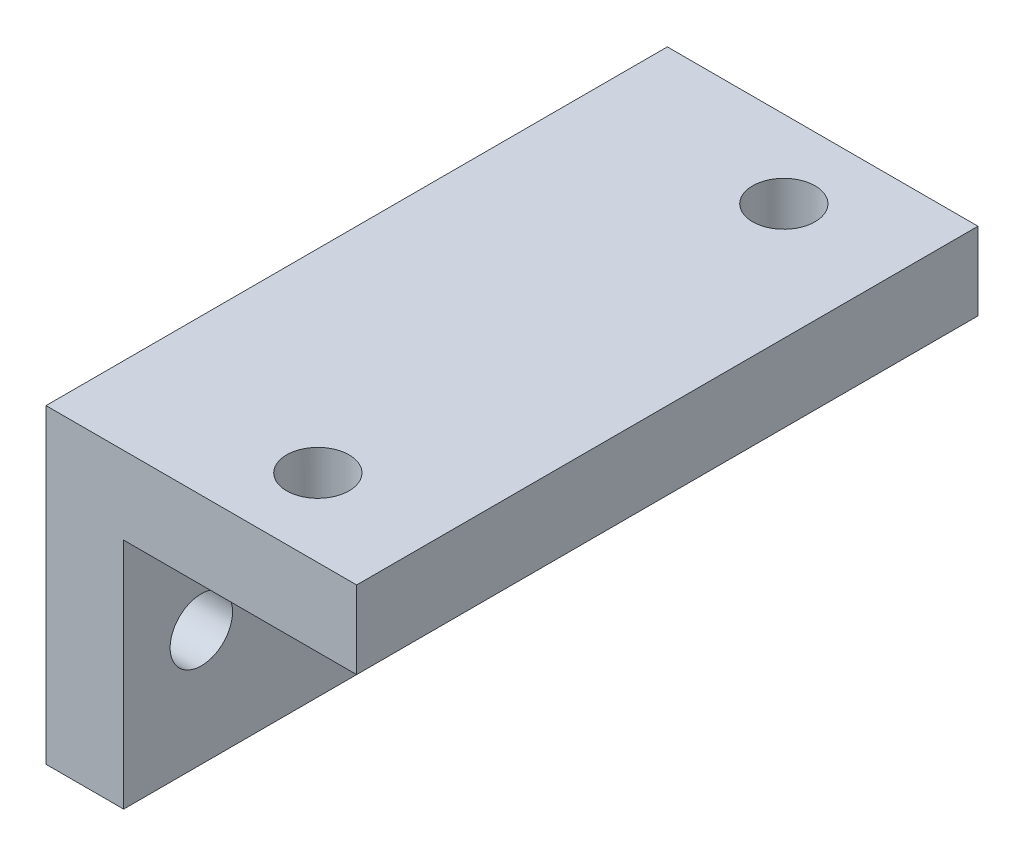
ISO-10303-21;
HEADER;
FILE_DESCRIPTION(('STEP AP214'),'2;1');
FILE_NAME('part.step','',(''),(''),'','','');
FILE_SCHEMA(('AUTOMOTIVE_DESIGN { 1 0 10303 214 1 1 1 1 }'));
ENDSEC;
DATA;
#1=APPLICATION_CONTEXT('core data for automotive mechanical design processes');
#2=APPLICATION_PROTOCOL_DEFINITION('international standard','automotive_design',2000,#1);
#3=PRODUCT_CONTEXT('',#1,'mechanical');
#4=PRODUCT('Part','Part','',(#3));
#5=PRODUCT_RELATED_PRODUCT_CATEGORY('part','',(#4));
#6=PRODUCT_DEFINITION_FORMATION('','',#4);
#7=PRODUCT_DEFINITION_CONTEXT('part definition',#1,'design');
#8=PRODUCT_DEFINITION('design','',#6,#7);
#9=PRODUCT_DEFINITION_SHAPE('','',#8);
#10=(LENGTH_UNIT() NAMED_UNIT(*) SI_UNIT(.MILLI.,.METRE.));
#11=(NAMED_UNIT(*) PLANE_ANGLE_UNIT() SI_UNIT($,.RADIAN.));
#12=(NAMED_UNIT(*) SI_UNIT($,.STERADIAN.) SOLID_ANGLE_UNIT());
#13=UNCERTAINTY_MEASURE_WITH_UNIT(LENGTH_MEASURE(1.E-05),#10,'distance_accuracy_value','');
#14=(GEOMETRIC_REPRESENTATION_CONTEXT(3) GLOBAL_UNCERTAINTY_ASSIGNED_CONTEXT((#13)) GLOBAL_UNIT_ASSIGNED_CONTEXT((#10,
#11,#12)) REPRESENTATION_CONTEXT('',''));
#15=CARTESIAN_POINT('',(0.,0.,0.));
#16=DIRECTION('',(0.,0.,1.));
#17=DIRECTION('',(1.,0.,0.));
#18=AXIS2_PLACEMENT_3D('',#15,#16,#17);
#19=CARTESIAN_POINT('',(0.,-19.05,25.4));
#20=DIRECTION('',(-1.,0.,0.));
#21=DIRECTION('',(0.,-1.,0.));
#22=AXIS2_PLACEMENT_3D('',#19,#20,#21);
#23=PLANE('',#22);
#24=CARTESIAN_POINT('',(0.,-9.525,-19.05));
#25=DIRECTION('',(1.,0.,0.));
#26=DIRECTION('',(0.,0.,-1.));
#27=AXIS2_PLACEMENT_3D('',#24,#25,#26);
#28=CIRCLE('',#27,2.55269999999999);
#29=CARTESIAN_POINT('',(0.,-9.525,-21.6027));
#30=VERTEX_POINT('',#29);
#31=EDGE_CURVE('E162',#30,#30,#28,.T.);
#32=ORIENTED_EDGE('',*,*,#31,.F.);
#33=EDGE_LOOP('',(#32));
#34=FACE_BOUND('',#33,.T.);
#35=CARTESIAN_POINT('',(0.,-9.525,19.05));
#36=DIRECTION('',(1.,0.,0.));
#37=DIRECTION('',(0.,0.,-1.));
#38=AXIS2_PLACEMENT_3D('',#35,#36,#37);
#39=CIRCLE('',#38,2.55269999999999);
#40=CARTESIAN_POINT('',(0.,-9.525,16.4973));
#41=VERTEX_POINT('',#40);
#42=EDGE_CURVE('E165',#41,#41,#39,.T.);
#43=ORIENTED_EDGE('',*,*,#42,.F.);
#44=EDGE_LOOP('',(#43));
#45=FACE_BOUND('',#44,.T.);
#46=DIRECTION('',(0.,1.,0.));
#47=VECTOR('',#46,1.);
#48=CARTESIAN_POINT('',(0.,-19.05,-25.4));
#49=LINE('',#48,#47);
#50=CARTESIAN_POINT('',(0.,-19.05,-25.4));
#51=VERTEX_POINT('',#50);
#52=CARTESIAN_POINT('',(0.,0.,-25.4));
#53=VERTEX_POINT('',#52);
#54=EDGE_CURVE('E117',#51,#53,#49,.T.);
#55=ORIENTED_EDGE('',*,*,#54,.T.);
#56=DIRECTION('',(0.,0.,-1.));
#57=VECTOR('',#56,1.);
#58=CARTESIAN_POINT('',(0.,0.,25.4));
#59=LINE('',#58,#57);
#60=CARTESIAN_POINT('',(0.,0.,25.4));
#61=VERTEX_POINT('',#60);
#62=EDGE_CURVE('E11',#61,#53,#59,.T.);
#63=ORIENTED_EDGE('',*,*,#62,.F.);
#64=DIRECTION('',(0.,1.,0.));
#65=VECTOR('',#64,1.);
#66=CARTESIAN_POINT('',(0.,-19.05,25.4));
#67=LINE('',#66,#65);
#68=CARTESIAN_POINT('',(0.,-19.05,25.4));
#69=VERTEX_POINT('',#68);
#70=EDGE_CURVE('E128',#69,#61,#67,.T.);
#71=ORIENTED_EDGE('',*,*,#70,.F.);
#72=DIRECTION('',(0.,0.,-1.));
#73=VECTOR('',#72,1.);
#74=CARTESIAN_POINT('',(0.,-19.05,25.4));
#75=LINE('',#74,#73);
#76=EDGE_CURVE('E113',#69,#51,#75,.T.);
#77=ORIENTED_EDGE('',*,*,#76,.T.);
#78=EDGE_LOOP('',(#55,#63,#71,#77));
#79=FACE_BOUND('',#78,.T.);
#80=ADVANCED_FACE('F33',(#34,#45,#79),#23,.F.);
#81=CARTESIAN_POINT('',(0.,0.,25.4));
#82=DIRECTION('',(0.,1.,0.));
#83=DIRECTION('',(0.,0.,1.));
#84=AXIS2_PLACEMENT_3D('',#81,#82,#83);
#85=PLANE('',#84);
#86=CARTESIAN_POINT('',(9.525,0.,19.05));
#87=DIRECTION('',(0.,-1.,0.));
#88=DIRECTION('',(0.,0.,-1.));
#89=AXIS2_PLACEMENT_3D('',#86,#87,#88);
#90=CIRCLE('',#89,2.55269999999999);
#91=CARTESIAN_POINT('',(9.525,0.,16.4973));
#92=VERTEX_POINT('',#91);
#93=EDGE_CURVE('E171',#92,#92,#90,.T.);
#94=ORIENTED_EDGE('',*,*,#93,.F.);
#95=EDGE_LOOP('',(#94));
#96=FACE_BOUND('',#95,.T.);
#97=CARTESIAN_POINT('',(9.52500000000001,0.,-19.05));
#98=DIRECTION('',(0.,-1.,0.));
#99=DIRECTION('',(0.,0.,-1.));
#100=AXIS2_PLACEMENT_3D('',#97,#98,#99);
#101=CIRCLE('',#100,2.55269999999999);
#102=CARTESIAN_POINT('',(9.52500000000001,0.,-21.6027));
#103=VERTEX_POINT('',#102);
#104=EDGE_CURVE('E182',#103,#103,#101,.T.);
#105=ORIENTED_EDGE('',*,*,#104,.F.);
#106=EDGE_LOOP('',(#105));
#107=FACE_BOUND('',#106,.T.);
#108=DIRECTION('',(1.,0.,0.));
#109=VECTOR('',#108,1.);
#110=CARTESIAN_POINT('',(0.,0.,-25.4));
#111=LINE('',#110,#109);
#112=CARTESIAN_POINT('',(19.05,0.,-25.4));
#113=VERTEX_POINT('',#112);
#114=EDGE_CURVE('E120',#53,#113,#111,.T.);
#115=ORIENTED_EDGE('',*,*,#114,.T.);
#116=DIRECTION('',(0.,0.,-1.));
#117=VECTOR('',#116,1.);
#118=CARTESIAN_POINT('',(19.05,0.,25.4));
#119=LINE('',#118,#117);
#120=CARTESIAN_POINT('',(19.05,0.,25.4));
#121=VERTEX_POINT('',#120);
#122=EDGE_CURVE('E41',#121,#113,#119,.T.);
#123=ORIENTED_EDGE('',*,*,#122,.F.);
#124=DIRECTION('',(1.,0.,0.));
#125=VECTOR('',#124,1.);
#126=CARTESIAN_POINT('',(0.,0.,25.4));
#127=LINE('',#126,#125);
#128=EDGE_CURVE('E86',#61,#121,#127,.T.);
#129=ORIENTED_EDGE('',*,*,#128,.F.);
#130=ORIENTED_EDGE('',*,*,#62,.T.);
#131=EDGE_LOOP('',(#115,#123,#129,#130));
#132=FACE_BOUND('',#131,.T.);
#133=ADVANCED_FACE('F153',(#96,#107,#132),#85,.F.);
#134=CARTESIAN_POINT('',(19.05,0.,25.4));
#135=DIRECTION('',(-1.,0.,0.));
#136=DIRECTION('',(0.,0.,1.));
#137=AXIS2_PLACEMENT_3D('',#134,#135,#136);
#138=PLANE('',#137);
#139=DIRECTION('',(0.,1.,0.));
#140=VECTOR('',#139,1.);
#141=CARTESIAN_POINT('',(19.05,0.,-25.4));
#142=LINE('',#141,#140);
#143=CARTESIAN_POINT('',(19.05,6.34999999999999,-25.4));
#144=VERTEX_POINT('',#143);
#145=EDGE_CURVE('E123',#113,#144,#142,.T.);
#146=ORIENTED_EDGE('',*,*,#145,.T.);
#147=DIRECTION('',(0.,0.,-1.));
#148=VECTOR('',#147,1.);
#149=CARTESIAN_POINT('',(19.05,6.34999999999999,25.4));
#150=LINE('',#149,#148);
#151=CARTESIAN_POINT('',(19.05,6.34999999999999,25.4));
#152=VERTEX_POINT('',#151);
#153=EDGE_CURVE('E108',#152,#144,#150,.T.);
#154=ORIENTED_EDGE('',*,*,#153,.F.);
#155=DIRECTION('',(0.,1.,0.));
#156=VECTOR('',#155,1.);
#157=CARTESIAN_POINT('',(19.05,0.,25.4));
#158=LINE('',#157,#156);
#159=EDGE_CURVE('E99',#121,#152,#158,.T.);
#160=ORIENTED_EDGE('',*,*,#159,.F.);
#161=ORIENTED_EDGE('',*,*,#122,.T.);
#162=EDGE_LOOP('',(#146,#154,#160,#161));
#163=FACE_BOUND('',#162,.T.);
#164=ADVANCED_FACE('F134',(#163),#138,.F.);
#165=CARTESIAN_POINT('',(19.05,6.34999999999999,25.4));
#166=DIRECTION('',(0.,-1.,0.));
#167=DIRECTION('',(1.,0.,0.));
#168=AXIS2_PLACEMENT_3D('',#165,#166,#167);
#169=PLANE('',#168);
#170=CARTESIAN_POINT('',(9.525,6.35,19.05));
#171=DIRECTION('',(0.,-1.,0.));
#172=DIRECTION('',(1.,0.,0.));
#173=AXIS2_PLACEMENT_3D('',#170,#171,#172);
#174=CIRCLE('',#173,2.55269999999999);
#175=CARTESIAN_POINT('',(12.0777,6.35,19.05));
#176=VERTEX_POINT('',#175);
#177=EDGE_CURVE('E179',#176,#176,#174,.T.);
#178=ORIENTED_EDGE('',*,*,#177,.T.);
#179=EDGE_LOOP('',(#178));
#180=FACE_BOUND('',#179,.T.);
#181=CARTESIAN_POINT('',(9.52500000000001,6.35,-19.05));
#182=DIRECTION('',(0.,-1.,0.));
#183=DIRECTION('',(1.,0.,0.));
#184=AXIS2_PLACEMENT_3D('',#181,#182,#183);
#185=CIRCLE('',#184,2.55269999999999);
#186=CARTESIAN_POINT('',(12.0777,6.35,-19.05));
#187=VERTEX_POINT('',#186);
#188=EDGE_CURVE('E121',#187,#187,#185,.T.);
#189=ORIENTED_EDGE('',*,*,#188,.T.);
#190=EDGE_LOOP('',(#189));
#191=FACE_BOUND('',#190,.T.);
#192=DIRECTION('',(-1.,0.,0.));
#193=VECTOR('',#192,1.);
#194=CARTESIAN_POINT('',(19.05,6.34999999999999,-25.4));
#195=LINE('',#194,#193);
#196=CARTESIAN_POINT('',(-6.35000000000001,6.35,-25.4));
#197=VERTEX_POINT('',#196);
#198=EDGE_CURVE('E107',#144,#197,#195,.T.);
#199=ORIENTED_EDGE('',*,*,#198,.T.);
#200=DIRECTION('',(0.,0.,-1.));
#201=VECTOR('',#200,1.);
#202=CARTESIAN_POINT('',(-6.35000000000001,6.35,25.4));
#203=LINE('',#202,#201);
#204=CARTESIAN_POINT('',(-6.35000000000001,6.35,25.4));
#205=VERTEX_POINT('',#204);
#206=EDGE_CURVE('E104',#205,#197,#203,.T.);
#207=ORIENTED_EDGE('',*,*,#206,.F.);
#208=DIRECTION('',(-1.,0.,0.));
#209=VECTOR('',#208,1.);
#210=CARTESIAN_POINT('',(19.05,6.34999999999999,25.4));
#211=LINE('',#210,#209);
#212=EDGE_CURVE('E93',#152,#205,#211,.T.);
#213=ORIENTED_EDGE('',*,*,#212,.F.);
#214=ORIENTED_EDGE('',*,*,#153,.T.);
#215=EDGE_LOOP('',(#199,#207,#213,#214));
#216=FACE_BOUND('',#215,.T.);
#217=ADVANCED_FACE('F105',(#180,#191,#216),#169,.F.);
#218=CARTESIAN_POINT('',(-6.35000000000001,6.35,25.4));
#219=DIRECTION('',(1.,0.,0.));
#220=DIRECTION('',(0.,1.,0.));
#221=AXIS2_PLACEMENT_3D('',#218,#219,#220);
#222=PLANE('',#221);
#223=CARTESIAN_POINT('',(-6.35,-9.525,-19.05));
#224=DIRECTION('',(1.,0.,0.));
#225=DIRECTION('',(0.,0.,-1.));
#226=AXIS2_PLACEMENT_3D('',#223,#224,#225);
#227=CIRCLE('',#226,2.55269999999999);
#228=CARTESIAN_POINT('',(-6.35,-9.525,-21.6027));
#229=VERTEX_POINT('',#228);
#230=EDGE_CURVE('E168',#229,#229,#227,.T.);
#231=ORIENTED_EDGE('',*,*,#230,.T.);
#232=EDGE_LOOP('',(#231));
#233=FACE_BOUND('',#232,.T.);
#234=CARTESIAN_POINT('',(-6.35,-9.525,19.05));
#235=DIRECTION('',(1.,0.,0.));
#236=DIRECTION('',(0.,0.,-1.));
#237=AXIS2_PLACEMENT_3D('',#234,#235,#236);
#238=CIRCLE('',#237,2.55269999999999);
#239=CARTESIAN_POINT('',(-6.35,-9.525,16.4973));
#240=VERTEX_POINT('',#239);
#241=EDGE_CURVE('E167',#240,#240,#238,.T.);
#242=ORIENTED_EDGE('',*,*,#241,.T.);
#243=EDGE_LOOP('',(#242));
#244=FACE_BOUND('',#243,.T.);
#245=DIRECTION('',(0.,-1.,0.));
#246=VECTOR('',#245,1.);
#247=CARTESIAN_POINT('',(-6.35000000000001,6.35,-25.4));
#248=LINE('',#247,#246);
#249=CARTESIAN_POINT('',(-6.35,-19.05,-25.4));
#250=VERTEX_POINT('',#249);
#251=EDGE_CURVE('E72',#197,#250,#248,.T.);
#252=ORIENTED_EDGE('',*,*,#251,.T.);
#253=DIRECTION('',(0.,0.,-1.));
#254=VECTOR('',#253,1.);
#255=CARTESIAN_POINT('',(-6.35,-19.05,25.4));
#256=LINE('',#255,#254);
#257=CARTESIAN_POINT('',(-6.35,-19.05,25.4));
#258=VERTEX_POINT('',#257);
#259=EDGE_CURVE('E109',#258,#250,#256,.T.);
#260=ORIENTED_EDGE('',*,*,#259,.F.);
#261=DIRECTION('',(0.,-1.,0.));
#262=VECTOR('',#261,1.);
#263=CARTESIAN_POINT('',(-6.35000000000001,6.35,25.4));
#264=LINE('',#263,#262);
#265=EDGE_CURVE('E97',#205,#258,#264,.T.);
#266=ORIENTED_EDGE('',*,*,#265,.F.);
#267=ORIENTED_EDGE('',*,*,#206,.T.);
#268=EDGE_LOOP('',(#252,#260,#266,#267));
#269=FACE_BOUND('',#268,.T.);
#270=ADVANCED_FACE('F111',(#233,#244,#269),#222,.F.);
#271=CARTESIAN_POINT('',(-6.35,-19.05,25.4));
#272=DIRECTION('',(0.,1.,0.));
#273=DIRECTION('',(0.,0.,1.));
#274=AXIS2_PLACEMENT_3D('',#271,#272,#273);
#275=PLANE('',#274);
#276=DIRECTION('',(1.,0.,0.));
#277=VECTOR('',#276,1.);
#278=CARTESIAN_POINT('',(-6.35,-19.05,-25.4));
#279=LINE('',#278,#277);
#280=EDGE_CURVE('E78',#250,#51,#279,.T.);
#281=ORIENTED_EDGE('',*,*,#280,.T.);
#282=ORIENTED_EDGE('',*,*,#76,.F.);
#283=DIRECTION('',(1.,0.,0.));
#284=VECTOR('',#283,1.);
#285=CARTESIAN_POINT('',(-6.35,-19.05,25.4));
#286=LINE('',#285,#284);
#287=EDGE_CURVE('E49',#258,#69,#286,.T.);
#288=ORIENTED_EDGE('',*,*,#287,.F.);
#289=ORIENTED_EDGE('',*,*,#259,.T.);
#290=EDGE_LOOP('',(#281,#282,#288,#289));
#291=FACE_BOUND('',#290,.T.);
#292=ADVANCED_FACE('F141',(#291),#275,.F.);
#293=CARTESIAN_POINT('',(0.,0.,25.4));
#294=DIRECTION('',(0.,0.,-1.));
#295=DIRECTION('',(-1.,0.,0.));
#296=AXIS2_PLACEMENT_3D('',#293,#294,#295);
#297=PLANE('',#296);
#298=ORIENTED_EDGE('',*,*,#70,.T.);
#299=ORIENTED_EDGE('',*,*,#128,.T.);
#300=ORIENTED_EDGE('',*,*,#159,.T.);
#301=ORIENTED_EDGE('',*,*,#212,.T.);
#302=ORIENTED_EDGE('',*,*,#265,.T.);
#303=ORIENTED_EDGE('',*,*,#287,.T.);
#304=EDGE_LOOP('',(#298,#299,#300,#301,#302,#303));
#305=FACE_BOUND('',#304,.T.);
#306=ADVANCED_FACE('F95',(#305),#297,.F.);
#307=CARTESIAN_POINT('',(0.,0.,-25.4));
#308=DIRECTION('',(0.,0.,-1.));
#309=DIRECTION('',(-1.,0.,0.));
#310=AXIS2_PLACEMENT_3D('',#307,#308,#309);
#311=PLANE('',#310);
#312=ORIENTED_EDGE('',*,*,#54,.F.);
#313=ORIENTED_EDGE('',*,*,#280,.F.);
#314=ORIENTED_EDGE('',*,*,#251,.F.);
#315=ORIENTED_EDGE('',*,*,#198,.F.);
#316=ORIENTED_EDGE('',*,*,#145,.F.);
#317=ORIENTED_EDGE('',*,*,#114,.F.);
#318=EDGE_LOOP('',(#312,#313,#314,#315,#316,#317));
#319=FACE_BOUND('',#318,.T.);
#320=ADVANCED_FACE('F137',(#319),#311,.T.);
#321=CARTESIAN_POINT('',(9.52500000000001,0.,-19.05));
#322=DIRECTION('',(0.,-1.,0.));
#323=DIRECTION('',(0.,0.,-1.));
#324=AXIS2_PLACEMENT_3D('',#321,#322,#323);
#325=CYLINDRICAL_SURFACE('',#324,2.55269999999999);
#326=ORIENTED_EDGE('',*,*,#188,.F.);
#327=EDGE_LOOP('',(#326));
#328=FACE_BOUND('',#327,.T.);
#329=ORIENTED_EDGE('',*,*,#104,.T.);
#330=EDGE_LOOP('',(#329));
#331=FACE_BOUND('',#330,.T.);
#332=ADVANCED_FACE('F191',(#328,#331),#325,.F.);
#333=CARTESIAN_POINT('',(9.525,0.,19.05));
#334=DIRECTION('',(0.,-1.,0.));
#335=DIRECTION('',(0.,0.,-1.));
#336=AXIS2_PLACEMENT_3D('',#333,#334,#335);
#337=CYLINDRICAL_SURFACE('',#336,2.55269999999999);
#338=ORIENTED_EDGE('',*,*,#177,.F.);
#339=EDGE_LOOP('',(#338));
#340=FACE_BOUND('',#339,.T.);
#341=ORIENTED_EDGE('',*,*,#93,.T.);
#342=EDGE_LOOP('',(#341));
#343=FACE_BOUND('',#342,.T.);
#344=ADVANCED_FACE('F194',(#340,#343),#337,.F.);
#345=CARTESIAN_POINT('',(0.,-9.525,19.05));
#346=DIRECTION('',(1.,0.,0.));
#347=DIRECTION('',(0.,0.,-1.));
#348=AXIS2_PLACEMENT_3D('',#345,#346,#347);
#349=CYLINDRICAL_SURFACE('',#348,2.55269999999999);
#350=ORIENTED_EDGE('',*,*,#241,.F.);
#351=EDGE_LOOP('',(#350));
#352=FACE_BOUND('',#351,.T.);
#353=ORIENTED_EDGE('',*,*,#42,.T.);
#354=EDGE_LOOP('',(#353));
#355=FACE_BOUND('',#354,.T.);
#356=ADVANCED_FACE('F202',(#352,#355),#349,.F.);
#357=CARTESIAN_POINT('',(0.,-9.525,-19.05));
#358=DIRECTION('',(1.,0.,0.));
#359=DIRECTION('',(0.,0.,-1.));
#360=AXIS2_PLACEMENT_3D('',#357,#358,#359);
#361=CYLINDRICAL_SURFACE('',#360,2.55269999999999);
#362=ORIENTED_EDGE('',*,*,#230,.F.);
#363=EDGE_LOOP('',(#362));
#364=FACE_BOUND('',#363,.T.);
#365=ORIENTED_EDGE('',*,*,#31,.T.);
#366=EDGE_LOOP('',(#365));
#367=FACE_BOUND('',#366,.T.);
#368=ADVANCED_FACE('F208',(#364,#367),#361,.F.);
#369=CLOSED_SHELL('',(#80,#133,#164,#217,#270,#292,#306,#320,#332,#344,#356,#368));
#370=MANIFOLD_SOLID_BREP('B2',#369);
#371=ADVANCED_BREP_SHAPE_REPRESENTATION('',(#18,#370),#14);
#372=SHAPE_DEFINITION_REPRESENTATION(#9,#371);
ENDSEC;
END-ISO-10303-21;
